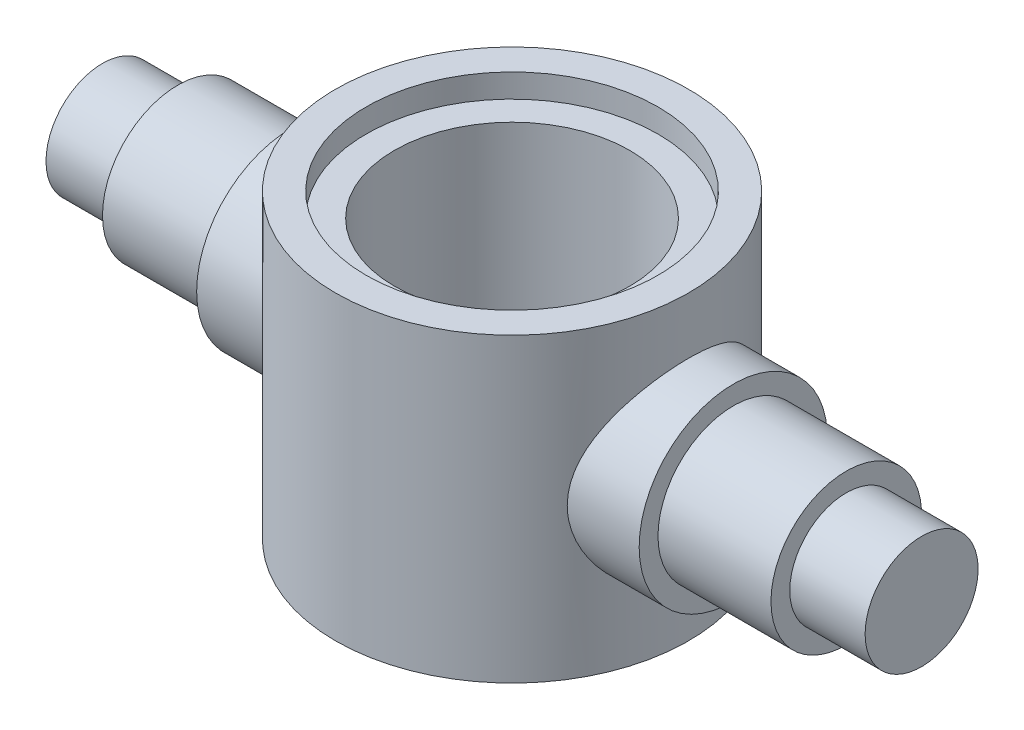
ISO-10303-21;
HEADER;
FILE_DESCRIPTION(('STEP AP214'),'2;1');
FILE_NAME('part.step','',(''),(''),'','','');
FILE_SCHEMA(('AUTOMOTIVE_DESIGN { 1 0 10303 214 1 1 1 1 }'));
ENDSEC;
DATA;
#1=APPLICATION_CONTEXT('core data for automotive mechanical design processes');
#2=APPLICATION_PROTOCOL_DEFINITION('international standard','automotive_design',2000,#1);
#3=PRODUCT_CONTEXT('',#1,'mechanical');
#4=PRODUCT('Part','Part','',(#3));
#5=PRODUCT_RELATED_PRODUCT_CATEGORY('part','',(#4));
#6=PRODUCT_DEFINITION_FORMATION('','',#4);
#7=PRODUCT_DEFINITION_CONTEXT('part definition',#1,'design');
#8=PRODUCT_DEFINITION('design','',#6,#7);
#9=PRODUCT_DEFINITION_SHAPE('','',#8);
#10=(LENGTH_UNIT() NAMED_UNIT(*) SI_UNIT(.MILLI.,.METRE.));
#11=(NAMED_UNIT(*) PLANE_ANGLE_UNIT() SI_UNIT($,.RADIAN.));
#12=(NAMED_UNIT(*) SI_UNIT($,.STERADIAN.) SOLID_ANGLE_UNIT());
#13=UNCERTAINTY_MEASURE_WITH_UNIT(LENGTH_MEASURE(1.E-05),#10,'distance_accuracy_value','');
#14=(GEOMETRIC_REPRESENTATION_CONTEXT(3) GLOBAL_UNCERTAINTY_ASSIGNED_CONTEXT((#13)) GLOBAL_UNIT_ASSIGNED_CONTEXT((#10,
#11,#12)) REPRESENTATION_CONTEXT('',''));
#15=CARTESIAN_POINT('',(0.,0.,0.));
#16=DIRECTION('',(0.,0.,1.));
#17=DIRECTION('',(1.,0.,0.));
#18=AXIS2_PLACEMENT_3D('',#15,#16,#17);
#19=CARTESIAN_POINT('',(-87.,0.,0.));
#20=DIRECTION('',(-1.,0.,0.));
#21=DIRECTION('',(0.,0.,1.));
#22=AXIS2_PLACEMENT_3D('',#19,#20,#21);
#23=CYLINDRICAL_SURFACE('',#22,20.);
#24=CARTESIAN_POINT('',(47.,0.,0.));
#25=DIRECTION('',(-1.,0.,0.));
#26=DIRECTION('',(0.,0.,1.));
#27=AXIS2_PLACEMENT_3D('',#24,#25,#26);
#28=CIRCLE('',#27,20.);
#29=CARTESIAN_POINT('',(47.,0.,20.));
#30=VERTEX_POINT('',#29);
#31=EDGE_CURVE('E122',#30,#30,#28,.T.);
#32=ORIENTED_EDGE('',*,*,#31,.T.);
#33=EDGE_LOOP('',(#32));
#34=FACE_BOUND('',#33,.T.);
#35=CARTESIAN_POINT('',(31.7214438511238,0.,20.));
#36=CARTESIAN_POINT('',(31.7214413197549,0.51570182078703,20.0000020694901));
#37=CARTESIAN_POINT('',(31.7340611544833,1.03138048086282,19.9800293716016));
#38=CARTESIAN_POINT('',(31.78403302211,2.05864988227541,19.900438433849));
#39=CARTESIAN_POINT('',(31.8213943564752,2.57023901293608,19.8408052837619));
#40=CARTESIAN_POINT('',(31.9194708010755,3.58588736208425,19.6826321785823));
#41=CARTESIAN_POINT('',(31.9802225019509,4.08993349078952,19.5840312579613));
#42=CARTESIAN_POINT('',(32.1228120348831,5.08606982289711,19.3492573673804));
#43=CARTESIAN_POINT('',(32.2046484379935,5.57816083404603,19.2130869435256));
#44=CARTESIAN_POINT('',(32.3860581030205,6.54451950031659,18.9056831081237));
#45=CARTESIAN_POINT('',(32.4855226248946,7.01887598033731,18.7346637469901));
#46=CARTESIAN_POINT('',(32.6994454251222,7.95042793399519,18.3587310871486));
#47=CARTESIAN_POINT('',(32.8139039052888,8.40762317654205,18.1538173322254));
#48=CARTESIAN_POINT('',(33.0546162705233,9.30288077314573,17.7117378683888));
#49=CARTESIAN_POINT('',(33.1808702230501,9.74094301775891,17.4745719750203));
#50=CARTESIAN_POINT('',(33.4419805558321,10.5963194801134,16.9695240952739));
#51=CARTESIAN_POINT('',(33.5768377375167,11.0136317584403,16.7016392454284));
#52=CARTESIAN_POINT('',(33.8650704272837,11.8645739174769,16.1097902433487));
#53=CARTESIAN_POINT('',(34.0189893385901,12.2959988155331,15.7829171398827));
#54=CARTESIAN_POINT('',(34.3293470223575,13.1302687696288,15.0959577863311));
#55=CARTESIAN_POINT('',(34.4857849024671,13.5331236847503,14.7358830932635));
#56=CARTESIAN_POINT('',(34.7975461774921,14.3089302194614,13.983797171619));
#57=CARTESIAN_POINT('',(34.9528686791821,14.6818598793333,13.5917629081743));
#58=CARTESIAN_POINT('',(35.2586221892624,15.3955976257313,12.7776616216099));
#59=CARTESIAN_POINT('',(35.4090530223891,15.7364045621611,12.3555935241317));
#60=CARTESIAN_POINT('',(35.7131343434369,16.4096071243127,11.4485193546584));
#61=CARTESIAN_POINT('',(35.8660898708008,16.7391795739264,10.9611773223788));
#62=CARTESIAN_POINT('',(36.15795916573,17.3557414498559,9.95619250224609));
#63=CARTESIAN_POINT('',(36.2968719878858,17.6427280097321,9.43854767799109));
#64=CARTESIAN_POINT('',(36.5565862255492,18.1710455089747,8.37643552854965));
#65=CARTESIAN_POINT('',(36.6773975574936,18.41240146501,7.8319831080315));
#66=CARTESIAN_POINT('',(36.8973465027634,18.8467311540172,6.71989087808538));
#67=CARTESIAN_POINT('',(36.9964867957197,19.0397108691608,6.15225394574328));
#68=CARTESIAN_POINT('',(37.1630977607828,19.3613843695543,5.04409084493633));
#69=CARTESIAN_POINT('',(37.2324534149286,19.4939561926983,4.50497266267377));
#70=CARTESIAN_POINT('',(37.3481817500676,19.7140932565086,3.41518253756318));
#71=CARTESIAN_POINT('',(37.3945555415014,19.8016606717114,2.86451115428459));
#72=CARTESIAN_POINT('',(37.4629444529341,19.9305089797469,1.75660288316388));
#73=CARTESIAN_POINT('',(37.4849739634215,19.9718172176824,1.19937007105453));
#74=CARTESIAN_POINT('',(37.5040622320361,20.0076218669366,0.0829912230449149));
#75=CARTESIAN_POINT('',(37.5011228064177,20.0021216831258,-0.476154670739204));
#76=CARTESIAN_POINT('',(37.4718952134176,19.9472644127489,-1.53619969533001));
#77=CARTESIAN_POINT('',(37.447941625247,19.9022922570022,-2.03739765283053));
#78=CARTESIAN_POINT('',(37.3804254421803,19.7749621587988,-3.03364583244081));
#79=CARTESIAN_POINT('',(37.336864425253,19.6926072248326,-3.52869654597526));
#80=CARTESIAN_POINT('',(37.2311612258913,19.4914513891179,-4.50931008296979));
#81=CARTESIAN_POINT('',(37.169018411795,19.3726492483943,-4.99487258329355));
#82=CARTESIAN_POINT('',(37.027573965224,19.0998645810979,-5.95344599270103));
#83=CARTESIAN_POINT('',(36.9482716812061,18.9458807186661,-6.42645642441813));
#84=CARTESIAN_POINT('',(36.7732171370194,18.6021940192179,-7.36274655171216));
#85=CARTESIAN_POINT('',(36.6772802358766,18.4120876761664,-7.82584330093237));
#86=CARTESIAN_POINT('',(36.4716939845828,17.9990703595971,-8.73397464778428));
#87=CARTESIAN_POINT('',(36.3620446819263,17.7761594997008,-9.17900930796888));
#88=CARTESIAN_POINT('',(36.131272901652,17.2992035665849,-10.0490666696836));
#89=CARTESIAN_POINT('',(36.010147984287,17.0451518693495,-10.4740850868216));
#90=CARTESIAN_POINT('',(35.7588507258766,16.5076300698118,-11.3022971689998));
#91=CARTESIAN_POINT('',(35.6286775729619,16.2241573265239,-11.7054888698094));
#92=CARTESIAN_POINT('',(35.3479837001356,15.5985893577811,-12.5291017597988));
#93=CARTESIAN_POINT('',(35.1967519612719,15.2534633423082,-12.9469820282129));
#94=CARTESIAN_POINT('',(34.8898864322466,14.5313798049263,-13.7525145719855));
#95=CARTESIAN_POINT('',(34.7342523759753,14.1544203560153,-14.1401650146786));
#96=CARTESIAN_POINT('',(34.4221027596449,13.3701405977241,-14.8839378037101));
#97=CARTESIAN_POINT('',(34.2655865379978,12.9627935496855,-15.2400317655331));
#98=CARTESIAN_POINT('',(34.0331936948478,12.3307195861961,-15.7488582454633));
#99=CARTESIAN_POINT('',(33.9561234387993,12.116510807287,-15.9142538119811));
#100=CARTESIAN_POINT('',(33.8032361130119,11.681195108966,-16.2364723560311));
#101=CARTESIAN_POINT('',(33.7274194456973,11.460086037774,-16.3932926166317));
#102=CARTESIAN_POINT('',(33.4907542486226,10.7512386458969,-16.8746465090342));
#103=CARTESIAN_POINT('',(33.3331303726971,10.2513083612089,-17.183049816068));
#104=CARTESIAN_POINT('',(33.031412186725,9.22309815410545,-17.7561472395889));
#105=CARTESIAN_POINT('',(32.8873166157949,8.69482088095187,-18.0208454312885));
#106=CARTESIAN_POINT('',(32.685373204814,7.88366626468449,-18.3830210735658));
#107=CARTESIAN_POINT('',(32.6204376652755,7.61021828324998,-18.497913664606));
#108=CARTESIAN_POINT('',(32.4959350905403,7.05750140500056,-18.715766604051));
#109=CARTESIAN_POINT('',(32.4363666973876,6.77823400271511,-18.8187299725957));
#110=CARTESIAN_POINT('',(32.2666643418834,5.93231320321243,-19.1092351768966));
#111=CARTESIAN_POINT('',(32.1654913144154,5.35737558916737,-19.2784662419718));
#112=CARTESIAN_POINT('',(31.9988861161109,4.23790937229368,-19.553644852043));
#113=CARTESIAN_POINT('',(31.9312218408957,3.69469269630251,-19.6636096891331));
#114=CARTESIAN_POINT('',(31.8230088610287,2.59831392694321,-19.8382645405692));
#115=CARTESIAN_POINT('',(31.7824584887167,2.04515244738684,-19.9029573394163));
#116=CARTESIAN_POINT('',(31.7303596382575,0.934456021777512,-19.985912455731));
#117=CARTESIAN_POINT('',(31.7187871405883,0.376925082364806,-20.0042132273243));
#118=CARTESIAN_POINT('',(31.7251253336693,-0.737521490785033,-19.9941613677195));
#119=CARTESIAN_POINT('',(31.7430332884698,-1.29443717682133,-19.9658130658148));
#120=CARTESIAN_POINT('',(31.8031799920284,-2.32861782358091,-19.8698354015943));
#121=CARTESIAN_POINT('',(31.8418706692055,-2.80663609459944,-19.807924313161));
#122=CARTESIAN_POINT('',(31.9394259539984,-3.75490327816778,-19.6502332853426));
#123=CARTESIAN_POINT('',(31.9982883825839,-4.22515302415461,-19.5544570041705));
#124=CARTESIAN_POINT('',(32.1343134663898,-5.15517852611526,-19.3301078005834));
#125=CARTESIAN_POINT('',(32.2114817676516,-5.61495100255831,-19.201524758723));
#126=CARTESIAN_POINT('',(32.3818032876244,-6.52146009102426,-18.9128757451853));
#127=CARTESIAN_POINT('',(32.4749575693242,-6.96819583385591,-18.7528076798059));
#128=CARTESIAN_POINT('',(32.6790924939383,-7.86590665438223,-18.394868382629));
#129=CARTESIAN_POINT('',(32.7906769723497,-8.31620402945306,-18.1956441409796));
#130=CARTESIAN_POINT('',(33.0255036652219,-9.19863635779434,-17.7658681503462));
#131=CARTESIAN_POINT('',(33.1487507806546,-9.63076356428131,-17.5353032131866));
#132=CARTESIAN_POINT('',(33.4038459659315,-10.4751592846687,-17.0443420482753));
#133=CARTESIAN_POINT('',(33.5356955921125,-10.8874241815632,-16.7839404160909));
#134=CARTESIAN_POINT('',(33.8049994573716,-11.6906450394737,-16.234702654998));
#135=CARTESIAN_POINT('',(33.9424541622186,-12.0815992232859,-15.9458641602208));
#136=CARTESIAN_POINT('',(34.2405301224172,-12.8968327162095,-15.2964635816017));
#137=CARTESIAN_POINT('',(34.4015818188523,-13.3175400727492,-14.931603315024));
#138=CARTESIAN_POINT('',(34.7230603870092,-14.1272437684801,-14.167947195493));
#139=CARTESIAN_POINT('',(34.8834872037932,-14.5162373768361,-13.7691484261636));
#140=CARTESIAN_POINT('',(35.1997632767684,-15.260632807053,-12.9392398085584));
#141=CARTESIAN_POINT('',(35.3556102206973,-15.6160178550132,-12.5081140164347));
#142=CARTESIAN_POINT('',(35.6587690792794,-16.2907536419708,-11.6156902573407));
#143=CARTESIAN_POINT('',(35.806080997209,-16.610104394801,-11.154392301953));
#144=CARTESIAN_POINT('',(36.094362584448,-17.2229254898073,-10.183991767619));
#145=CARTESIAN_POINT('',(36.2348110597733,-17.514759715978,-9.67369760070825));
#146=CARTESIAN_POINT('',(36.4984653992381,-18.0538993037871,-8.62576948259295));
#147=CARTESIAN_POINT('',(36.6216704607758,-18.3012025928681,-8.08813426037456));
#148=CARTESIAN_POINT('',(36.8470982051941,-18.7482234390732,-6.98966501489582));
#149=CARTESIAN_POINT('',(36.9493376652579,-18.9479790657331,-6.42884997594813));
#150=CARTESIAN_POINT('',(37.1297639484466,-19.297455902112,-5.28809092848528));
#151=CARTESIAN_POINT('',(37.2079541014261,-19.4471840388594,-4.70814958051197));
#152=CARTESIAN_POINT('',(37.3313253205698,-19.6821437839116,-3.59240502635106));
#153=CARTESIAN_POINT('',(37.3790061362655,-19.772289467478,-3.05790886541162));
#154=CARTESIAN_POINT('',(37.4514756910781,-19.9089530850035,-1.98183214986325));
#155=CARTESIAN_POINT('',(37.4762659729213,-19.9554739590957,-1.44025207517585));
#156=CARTESIAN_POINT('',(37.5022507552866,-20.0042303784103,-0.354749121186335));
#157=CARTESIAN_POINT('',(37.5034543739556,-20.0064830368679,0.189172771475637));
#158=CARTESIAN_POINT('',(37.48225381449,-19.9667133892609,1.27491994456976));
#159=CARTESIAN_POINT('',(37.4598506152682,-19.924692919087,1.81674531100428));
#160=CARTESIAN_POINT('',(37.3948348646929,-19.8021741343333,2.84994112337195));
#161=CARTESIAN_POINT('',(37.3540126106644,-19.7250802887853,3.34183352060927));
#162=CARTESIAN_POINT('',(37.2539453649987,-19.5349170787364,4.31666546450882));
#163=CARTESIAN_POINT('',(37.194701640845,-19.4218501893373,4.79960562470529));
#164=CARTESIAN_POINT('',(37.0591262897866,-19.1609304561323,5.75354734954825));
#165=CARTESIAN_POINT('',(36.9827935773181,-19.013075402407,6.2245481536402));
#166=CARTESIAN_POINT('',(36.8147019731365,-18.6840113486702,7.15191066342814));
#167=CARTESIAN_POINT('',(36.7229423463092,-18.5028007591816,7.60827167028259));
#168=CARTESIAN_POINT('',(36.5221995412676,-18.1011724085677,8.52087859171127));
#169=CARTESIAN_POINT('',(36.4126979975698,-17.8795354415977,8.97647337098126));
#170=CARTESIAN_POINT('',(36.181500114623,-17.4038544118732,9.86715686443599));
#171=CARTESIAN_POINT('',(36.0598036029384,-17.1498098908654,10.302245288535));
#172=CARTESIAN_POINT('',(35.806694576421,-16.6110188950497,11.1501774118709));
#173=CARTESIAN_POINT('',(35.6752791500568,-16.3262632081789,11.5630143806003));
#174=CARTESIAN_POINT('',(35.4054002469024,-15.7278002398746,12.3647313652331));
#175=CARTESIAN_POINT('',(35.2669360542545,-15.4140900152394,12.7536089389721));
#176=CARTESIAN_POINT('',(34.9701881968126,-14.7231741657298,13.5475000625257));
#177=CARTESIAN_POINT('',(34.8114036833638,-14.3427819832896,13.9495579337109));
#178=CARTESIAN_POINT('',(34.4924513936402,-13.5503054853644,14.7205601593971));
#179=CARTESIAN_POINT('',(34.332283513974,-13.1382187825437,15.0895020149462));
#180=CARTESIAN_POINT('',(34.014472849533,-12.2838013095431,15.7928698949614));
#181=CARTESIAN_POINT('',(33.8568330900945,-11.8414372203949,16.1272568440539));
#182=CARTESIAN_POINT('',(33.5485438943854,-10.928825106116,16.7591408544251));
#183=CARTESIAN_POINT('',(33.397894058606,-10.4585786781072,17.0566400256525));
#184=CARTESIAN_POINT('',(33.1001514260429,-9.4660459672117,17.6277979510643));
#185=CARTESIAN_POINT('',(32.9536922787388,-8.94232063328413,17.8992953962635));
#186=CARTESIAN_POINT('',(32.678737395606,-7.86886091086252,18.3964918948525));
#187=CARTESIAN_POINT('',(32.5502447158571,-7.31912211873665,18.6221831595938));
#188=CARTESIAN_POINT('',(32.3168186734203,-6.19886278931984,19.024384907481));
#189=CARTESIAN_POINT('',(32.2118191995507,-5.6284059565814,19.201033745358));
#190=CARTESIAN_POINT('',(32.0297506359913,-4.47007390274584,19.5032386917275));
#191=CARTESIAN_POINT('',(31.9526630686697,-3.88221048468109,19.6288286079236));
#192=CARTESIAN_POINT('',(31.8356174945192,-2.74707803789609,19.8180391560448));
#193=CARTESIAN_POINT('',(31.792971577938,-2.20083618219898,19.8861700850289));
#194=CARTESIAN_POINT('',(31.7358855783688,-1.1030541872115,19.9771502535946));
#195=CARTESIAN_POINT('',(31.7214465582793,-0.551513849049512,19.9999977867977));
#196=CARTESIAN_POINT('',(31.7214438511238,0.,20.));
#197=B_SPLINE_CURVE_WITH_KNOTS('',3,(#35,#36,#37,#38,#39,#40,#41,#42,#43,#44,#45,#46,#47,#48,
#49,#50,#51,#52,#53,#54,#55,#56,#57,#58,#59,#60,#61,#62,#63,#64,#65,#66,#67,#68,#69,#70,#71,#72,
#73,#74,#75,#76,#77,#78,#79,#80,#81,#82,#83,#84,#85,#86,#87,#88,#89,#90,#91,#92,#93,#94,#95,#96,
#97,#98,#99,#100,#101,#102,#103,#104,#105,#106,#107,#108,#109,#110,#111,#112,#113,#114,#115,
#116,#117,#118,#119,#120,#121,#122,#123,#124,#125,#126,#127,#128,#129,#130,#131,#132,#133,#134,
#135,#136,#137,#138,#139,#140,#141,#142,#143,#144,#145,#146,#147,#148,#149,#150,#151,#152,#153,
#154,#155,#156,#157,#158,#159,#160,#161,#162,#163,#164,#165,#166,#167,#168,#169,#170,#171,#172,
#173,#174,#175,#176,#177,#178,#179,#180,#181,#182,#183,#184,#185,#186,#187,#188,#189,#190,#191,
#192,#193,#194,#195,#196),.UNSPECIFIED.,.T.,.F.,(4,2,2,2,2,2,2,2,2,2,2,2,2,2,2,2,2,2,2,2,2,2,2,
2,2,2,2,2,2,2,2,2,2,2,2,2,2,2,2,2,2,2,2,2,2,2,2,2,2,2,2,2,2,2,2,2,2,2,2,2,2,2,2,2,2,2,2,2,2,2,2,
2,2,2,2,2,2,2,2,2,4),(0.,1.54653102412566,3.0936437906582,4.6431866763651,6.19262457451161,
7.73281777044317,9.27303169891885,10.8132544364963,12.3536208628203,14.040050545629,
15.7258954056102,17.4129662674639,19.1000975089252,20.9213689398888,22.7427629043674,
24.5631553877423,26.3833226515055,28.059489973695,29.7355762987163,31.4106713180379,
33.0856444910623,34.5951981761441,36.1046303969191,37.6141139345514,39.1236547971857,
40.6511712473975,42.1786824070403,43.706519051639,45.2344929615787,46.9207293716491,
48.6070679294707,50.2949082420574,51.1388926875629,51.9831430032304,53.8052600800145,
55.6272071603968,56.5377943533881,57.4481505054851,59.2683063920866,60.9409458022714,
62.6134823260862,64.2846320385256,65.9556266677268,67.4046488518206,68.853514556278,
70.3028277136488,71.7522372805584,73.2653941231695,74.7791896853173,76.2932598817077,
77.8074561511926,79.544658326591,81.2820099328677,83.0202241182139,84.7584376362927,
86.569187179535,88.3800209768546,90.1893999970791,91.9985283787263,93.6287396195841,
95.2588409829981,96.8883121683758,98.5177157865105,100.014703624748,101.511588485983,
103.008568462574,104.505619792595,106.059030766784,107.612463709144,109.166363919111,
110.720422255902,112.445990412954,114.171688673013,115.899317510118,117.626847482728,
119.447862072683,121.269186039717,123.085318370938,124.900246218139,126.554111116078,
128.208038334114),.UNSPECIFIED.);
#198=CARTESIAN_POINT('',(31.7214438511238,0.,20.));
#199=VERTEX_POINT('',#198);
#200=EDGE_CURVE('E10',#199,#199,#197,.T.);
#201=ORIENTED_EDGE('',*,*,#200,.F.);
#202=EDGE_LOOP('',(#201));
#203=FACE_BOUND('',#202,.T.);
#204=ADVANCED_FACE('F43',(#34,#203),#23,.T.);
#205=CARTESIAN_POINT('',(87.,0.,0.));
#206=DIRECTION('',(-1.,0.,0.));
#207=DIRECTION('',(0.,0.,1.));
#208=AXIS2_PLACEMENT_3D('',#205,#206,#207);
#209=PLANE('',#208);
#210=CARTESIAN_POINT('',(87.,0.,0.));
#211=DIRECTION('',(-1.,0.,0.));
#212=DIRECTION('',(0.,0.,1.));
#213=AXIS2_PLACEMENT_3D('',#210,#211,#212);
#214=CIRCLE('',#213,12.);
#215=CARTESIAN_POINT('',(87.,0.,12.));
#216=VERTEX_POINT('',#215);
#217=EDGE_CURVE('E61',#216,#216,#214,.T.);
#218=ORIENTED_EDGE('',*,*,#217,.F.);
#219=EDGE_LOOP('',(#218));
#220=FACE_BOUND('',#219,.T.);
#221=ADVANCED_FACE('F45',(#220),#209,.F.);
#222=CARTESIAN_POINT('',(-87.,0.,0.));
#223=DIRECTION('',(-1.,0.,0.));
#224=DIRECTION('',(0.,0.,1.));
#225=AXIS2_PLACEMENT_3D('',#222,#223,#224);
#226=CYLINDRICAL_SURFACE('',#225,12.);
#227=CARTESIAN_POINT('',(71.,0.,0.));
#228=DIRECTION('',(-1.,0.,0.));
#229=DIRECTION('',(0.,0.,1.));
#230=AXIS2_PLACEMENT_3D('',#227,#228,#229);
#231=CIRCLE('',#230,12.);
#232=CARTESIAN_POINT('',(71.,0.,12.));
#233=VERTEX_POINT('',#232);
#234=EDGE_CURVE('E66',#233,#233,#231,.T.);
#235=ORIENTED_EDGE('',*,*,#234,.F.);
#236=EDGE_LOOP('',(#235));
#237=FACE_BOUND('',#236,.T.);
#238=ORIENTED_EDGE('',*,*,#217,.T.);
#239=EDGE_LOOP('',(#238));
#240=FACE_BOUND('',#239,.T.);
#241=ADVANCED_FACE('F117',(#237,#240),#226,.T.);
#242=CARTESIAN_POINT('',(71.,0.,-12.));
#243=DIRECTION('',(-1.,0.,0.));
#244=DIRECTION('',(0.,0.,1.));
#245=AXIS2_PLACEMENT_3D('',#242,#243,#244);
#246=PLANE('',#245);
#247=CARTESIAN_POINT('',(71.,0.,0.));
#248=DIRECTION('',(-1.,0.,0.));
#249=DIRECTION('',(0.,0.,1.));
#250=AXIS2_PLACEMENT_3D('',#247,#248,#249);
#251=CIRCLE('',#250,16.);
#252=CARTESIAN_POINT('',(71.,0.,16.));
#253=VERTEX_POINT('',#252);
#254=EDGE_CURVE('E131',#253,#253,#251,.T.);
#255=ORIENTED_EDGE('',*,*,#254,.F.);
#256=EDGE_LOOP('',(#255));
#257=FACE_BOUND('',#256,.T.);
#258=ORIENTED_EDGE('',*,*,#234,.T.);
#259=EDGE_LOOP('',(#258));
#260=FACE_BOUND('',#259,.T.);
#261=ADVANCED_FACE('F144',(#257,#260),#246,.F.);
#262=CARTESIAN_POINT('',(-87.,0.,0.));
#263=DIRECTION('',(-1.,0.,0.));
#264=DIRECTION('',(0.,0.,1.));
#265=AXIS2_PLACEMENT_3D('',#262,#263,#264);
#266=CYLINDRICAL_SURFACE('',#265,16.);
#267=CARTESIAN_POINT('',(47.,0.,0.));
#268=DIRECTION('',(-1.,0.,0.));
#269=DIRECTION('',(0.,0.,1.));
#270=AXIS2_PLACEMENT_3D('',#267,#268,#269);
#271=CIRCLE('',#270,16.);
#272=CARTESIAN_POINT('',(47.,0.,16.));
#273=VERTEX_POINT('',#272);
#274=EDGE_CURVE('E125',#273,#273,#271,.T.);
#275=ORIENTED_EDGE('',*,*,#274,.F.);
#276=EDGE_LOOP('',(#275));
#277=FACE_BOUND('',#276,.T.);
#278=ORIENTED_EDGE('',*,*,#254,.T.);
#279=EDGE_LOOP('',(#278));
#280=FACE_BOUND('',#279,.T.);
#281=ADVANCED_FACE('F152',(#277,#280),#266,.T.);
#282=CARTESIAN_POINT('',(47.,0.,-16.));
#283=DIRECTION('',(-1.,0.,0.));
#284=DIRECTION('',(0.,0.,1.));
#285=AXIS2_PLACEMENT_3D('',#282,#283,#284);
#286=PLANE('',#285);
#287=ORIENTED_EDGE('',*,*,#31,.F.);
#288=EDGE_LOOP('',(#287));
#289=FACE_BOUND('',#288,.T.);
#290=ORIENTED_EDGE('',*,*,#274,.T.);
#291=EDGE_LOOP('',(#290));
#292=FACE_BOUND('',#291,.T.);
#293=ADVANCED_FACE('F81',(#289,#292),#286,.F.);
#294=CARTESIAN_POINT('',(0.,32.,0.));
#295=DIRECTION('',(0.,-1.,0.));
#296=DIRECTION('',(0.,0.,-1.));
#297=AXIS2_PLACEMENT_3D('',#294,#295,#296);
#298=CYLINDRICAL_SURFACE('',#297,37.5);
#299=CARTESIAN_POINT('',(-31.7214438511238,0.,20.));
#300=CARTESIAN_POINT('',(-31.7214413197549,-0.51570182078703,20.0000020694901));
#301=CARTESIAN_POINT('',(-31.7340611544833,-1.03138048086282,19.9800293716016));
#302=CARTESIAN_POINT('',(-31.78403302211,-2.05864988227541,19.900438433849));
#303=CARTESIAN_POINT('',(-31.8213943564752,-2.57023901293608,19.8408052837619));
#304=CARTESIAN_POINT('',(-31.9194708010755,-3.58588736208425,19.6826321785823));
#305=CARTESIAN_POINT('',(-31.9802225019509,-4.08993349078952,19.5840312579613));
#306=CARTESIAN_POINT('',(-32.1228120348831,-5.08606982289711,19.3492573673804));
#307=CARTESIAN_POINT('',(-32.2046484379935,-5.57816083404603,19.2130869435256));
#308=CARTESIAN_POINT('',(-32.3860581030205,-6.54451950031659,18.9056831081237));
#309=CARTESIAN_POINT('',(-32.4855226248946,-7.01887598033731,18.7346637469901));
#310=CARTESIAN_POINT('',(-32.6994454251222,-7.95042793399519,18.3587310871486));
#311=CARTESIAN_POINT('',(-32.8139039052888,-8.40762317654205,18.1538173322254));
#312=CARTESIAN_POINT('',(-33.0546162705233,-9.30288077314573,17.7117378683888));
#313=CARTESIAN_POINT('',(-33.1808702230501,-9.74094301775891,17.4745719750203));
#314=CARTESIAN_POINT('',(-33.4419805558321,-10.5963194801134,16.9695240952739));
#315=CARTESIAN_POINT('',(-33.5768377375167,-11.0136317584403,16.7016392454284));
#316=CARTESIAN_POINT('',(-33.8650704272837,-11.8645739174769,16.1097902433487));
#317=CARTESIAN_POINT('',(-34.0189893385901,-12.2959988155331,15.7829171398827));
#318=CARTESIAN_POINT('',(-34.3293470223575,-13.1302687696288,15.0959577863311));
#319=CARTESIAN_POINT('',(-34.4857849024671,-13.5331236847503,14.7358830932635));
#320=CARTESIAN_POINT('',(-34.7975461774921,-14.3089302194614,13.983797171619));
#321=CARTESIAN_POINT('',(-34.9528686791821,-14.6818598793333,13.5917629081743));
#322=CARTESIAN_POINT('',(-35.2586221892624,-15.3955976257313,12.7776616216099));
#323=CARTESIAN_POINT('',(-35.4090530223891,-15.7364045621611,12.3555935241317));
#324=CARTESIAN_POINT('',(-35.7131343434369,-16.4096071243127,11.4485193546584));
#325=CARTESIAN_POINT('',(-35.8660898708008,-16.7391795739264,10.9611773223788));
#326=CARTESIAN_POINT('',(-36.15795916573,-17.3557414498559,9.95619250224609));
#327=CARTESIAN_POINT('',(-36.2968719878858,-17.6427280097321,9.43854767799109));
#328=CARTESIAN_POINT('',(-36.5565862255492,-18.1710455089747,8.37643552854965));
#329=CARTESIAN_POINT('',(-36.6773975574936,-18.41240146501,7.8319831080315));
#330=CARTESIAN_POINT('',(-36.8973465027634,-18.8467311540172,6.71989087808538));
#331=CARTESIAN_POINT('',(-36.9964867957197,-19.0397108691608,6.15225394574328));
#332=CARTESIAN_POINT('',(-37.1630977607828,-19.3613843695543,5.04409084493633));
#333=CARTESIAN_POINT('',(-37.2324534149286,-19.4939561926983,4.50497266267377));
#334=CARTESIAN_POINT('',(-37.3481817500676,-19.7140932565086,3.41518253756318));
#335=CARTESIAN_POINT('',(-37.3945555415014,-19.8016606717114,2.86451115428459));
#336=CARTESIAN_POINT('',(-37.4629444529341,-19.9305089797469,1.75660288316388));
#337=CARTESIAN_POINT('',(-37.4849739634215,-19.9718172176824,1.19937007105453));
#338=CARTESIAN_POINT('',(-37.5040622320361,-20.0076218669366,0.0829912230449149));
#339=CARTESIAN_POINT('',(-37.5011228064177,-20.0021216831258,-0.476154670739204));
#340=CARTESIAN_POINT('',(-37.4718952134176,-19.9472644127489,-1.53619969533001));
#341=CARTESIAN_POINT('',(-37.447941625247,-19.9022922570022,-2.03739765283053));
#342=CARTESIAN_POINT('',(-37.3804254421803,-19.7749621587988,-3.03364583244081));
#343=CARTESIAN_POINT('',(-37.336864425253,-19.6926072248326,-3.52869654597526));
#344=CARTESIAN_POINT('',(-37.2311612258913,-19.4914513891179,-4.50931008296979));
#345=CARTESIAN_POINT('',(-37.169018411795,-19.3726492483943,-4.99487258329355));
#346=CARTESIAN_POINT('',(-37.027573965224,-19.0998645810979,-5.95344599270103));
#347=CARTESIAN_POINT('',(-36.9482716812061,-18.9458807186661,-6.42645642441813));
#348=CARTESIAN_POINT('',(-36.7732171370194,-18.6021940192179,-7.36274655171216));
#349=CARTESIAN_POINT('',(-36.6772802358766,-18.4120876761664,-7.82584330093237));
#350=CARTESIAN_POINT('',(-36.4716939845828,-17.9990703595971,-8.73397464778428));
#351=CARTESIAN_POINT('',(-36.3620446819263,-17.7761594997008,-9.17900930796888));
#352=CARTESIAN_POINT('',(-36.131272901652,-17.2992035665849,-10.0490666696836));
#353=CARTESIAN_POINT('',(-36.010147984287,-17.0451518693495,-10.4740850868216));
#354=CARTESIAN_POINT('',(-35.7588507258766,-16.5076300698118,-11.3022971689998));
#355=CARTESIAN_POINT('',(-35.6286775729619,-16.2241573265239,-11.7054888698094));
#356=CARTESIAN_POINT('',(-35.3479837001356,-15.5985893577811,-12.5291017597988));
#357=CARTESIAN_POINT('',(-35.1967519612719,-15.2534633423082,-12.9469820282129));
#358=CARTESIAN_POINT('',(-34.8898864322466,-14.5313798049263,-13.7525145719855));
#359=CARTESIAN_POINT('',(-34.7342523759753,-14.1544203560153,-14.1401650146786));
#360=CARTESIAN_POINT('',(-34.4221027596449,-13.3701405977241,-14.8839378037101));
#361=CARTESIAN_POINT('',(-34.2655865379978,-12.9627935496855,-15.2400317655331));
#362=CARTESIAN_POINT('',(-34.0331936948478,-12.3307195861961,-15.7488582454633));
#363=CARTESIAN_POINT('',(-33.9561234387993,-12.116510807287,-15.9142538119811));
#364=CARTESIAN_POINT('',(-33.8032361130119,-11.681195108966,-16.2364723560311));
#365=CARTESIAN_POINT('',(-33.7274194456973,-11.460086037774,-16.3932926166317));
#366=CARTESIAN_POINT('',(-33.4907542486226,-10.7512386458969,-16.8746465090342));
#367=CARTESIAN_POINT('',(-33.3331303726971,-10.2513083612089,-17.183049816068));
#368=CARTESIAN_POINT('',(-33.031412186725,-9.22309815410545,-17.7561472395889));
#369=CARTESIAN_POINT('',(-32.8873166157949,-8.69482088095187,-18.0208454312885));
#370=CARTESIAN_POINT('',(-32.685373204814,-7.88366626468449,-18.3830210735658));
#371=CARTESIAN_POINT('',(-32.6204376652755,-7.61021828324998,-18.497913664606));
#372=CARTESIAN_POINT('',(-32.4959350905403,-7.05750140500056,-18.715766604051));
#373=CARTESIAN_POINT('',(-32.4363666973876,-6.77823400271511,-18.8187299725957));
#374=CARTESIAN_POINT('',(-32.2666643418834,-5.93231320321243,-19.1092351768966));
#375=CARTESIAN_POINT('',(-32.1654913144154,-5.35737558916737,-19.2784662419718));
#376=CARTESIAN_POINT('',(-31.9988861161109,-4.23790937229368,-19.553644852043));
#377=CARTESIAN_POINT('',(-31.9312218408957,-3.69469269630251,-19.6636096891331));
#378=CARTESIAN_POINT('',(-31.8230088610287,-2.59831392694321,-19.8382645405692));
#379=CARTESIAN_POINT('',(-31.7824584887167,-2.04515244738684,-19.9029573394163));
#380=CARTESIAN_POINT('',(-31.7303596382575,-0.934456021777512,-19.985912455731));
#381=CARTESIAN_POINT('',(-31.7187871405883,-0.376925082364806,-20.0042132273243));
#382=CARTESIAN_POINT('',(-31.7251253336693,0.737521490785033,-19.9941613677195));
#383=CARTESIAN_POINT('',(-31.7430332884698,1.29443717682133,-19.9658130658148));
#384=CARTESIAN_POINT('',(-31.8031799920284,2.32861782358091,-19.8698354015943));
#385=CARTESIAN_POINT('',(-31.8418706692055,2.80663609459944,-19.807924313161));
#386=CARTESIAN_POINT('',(-31.9394259539984,3.75490327816778,-19.6502332853426));
#387=CARTESIAN_POINT('',(-31.9982883825839,4.22515302415461,-19.5544570041705));
#388=CARTESIAN_POINT('',(-32.1343134663898,5.15517852611526,-19.3301078005834));
#389=CARTESIAN_POINT('',(-32.2114817676516,5.61495100255831,-19.201524758723));
#390=CARTESIAN_POINT('',(-32.3818032876244,6.52146009102426,-18.9128757451853));
#391=CARTESIAN_POINT('',(-32.4749575693242,6.96819583385591,-18.7528076798059));
#392=CARTESIAN_POINT('',(-32.6790924939383,7.86590665438223,-18.394868382629));
#393=CARTESIAN_POINT('',(-32.7906769723497,8.31620402945306,-18.1956441409796));
#394=CARTESIAN_POINT('',(-33.0255036652219,9.19863635779434,-17.7658681503462));
#395=CARTESIAN_POINT('',(-33.1487507806546,9.63076356428131,-17.5353032131866));
#396=CARTESIAN_POINT('',(-33.4038459659315,10.4751592846687,-17.0443420482753));
#397=CARTESIAN_POINT('',(-33.5356955921125,10.8874241815632,-16.7839404160909));
#398=CARTESIAN_POINT('',(-33.8049994573716,11.6906450394737,-16.234702654998));
#399=CARTESIAN_POINT('',(-33.9424541622186,12.0815992232859,-15.9458641602208));
#400=CARTESIAN_POINT('',(-34.2405301224172,12.8968327162095,-15.2964635816017));
#401=CARTESIAN_POINT('',(-34.4015818188523,13.3175400727492,-14.931603315024));
#402=CARTESIAN_POINT('',(-34.7230603870092,14.1272437684801,-14.167947195493));
#403=CARTESIAN_POINT('',(-34.8834872037932,14.5162373768361,-13.7691484261636));
#404=CARTESIAN_POINT('',(-35.1997632767684,15.260632807053,-12.9392398085584));
#405=CARTESIAN_POINT('',(-35.3556102206973,15.6160178550132,-12.5081140164347));
#406=CARTESIAN_POINT('',(-35.6587690792794,16.2907536419708,-11.6156902573407));
#407=CARTESIAN_POINT('',(-35.806080997209,16.610104394801,-11.154392301953));
#408=CARTESIAN_POINT('',(-36.094362584448,17.2229254898073,-10.183991767619));
#409=CARTESIAN_POINT('',(-36.2348110597733,17.514759715978,-9.67369760070825));
#410=CARTESIAN_POINT('',(-36.4984653992381,18.0538993037871,-8.62576948259295));
#411=CARTESIAN_POINT('',(-36.6216704607758,18.3012025928681,-8.08813426037456));
#412=CARTESIAN_POINT('',(-36.8470982051941,18.7482234390732,-6.98966501489582));
#413=CARTESIAN_POINT('',(-36.9493376652579,18.9479790657331,-6.42884997594813));
#414=CARTESIAN_POINT('',(-37.1297639484466,19.297455902112,-5.28809092848528));
#415=CARTESIAN_POINT('',(-37.2079541014261,19.4471840388594,-4.70814958051197));
#416=CARTESIAN_POINT('',(-37.3313253205698,19.6821437839116,-3.59240502635106));
#417=CARTESIAN_POINT('',(-37.3790061362655,19.772289467478,-3.05790886541162));
#418=CARTESIAN_POINT('',(-37.4514756910781,19.9089530850035,-1.98183214986325));
#419=CARTESIAN_POINT('',(-37.4762659729213,19.9554739590957,-1.44025207517585));
#420=CARTESIAN_POINT('',(-37.5022507552866,20.0042303784103,-0.354749121186335));
#421=CARTESIAN_POINT('',(-37.5034543739556,20.0064830368679,0.189172771475637));
#422=CARTESIAN_POINT('',(-37.48225381449,19.9667133892609,1.27491994456976));
#423=CARTESIAN_POINT('',(-37.4598506152682,19.924692919087,1.81674531100428));
#424=CARTESIAN_POINT('',(-37.3948348646929,19.8021741343333,2.84994112337195));
#425=CARTESIAN_POINT('',(-37.3540126106644,19.7250802887853,3.34183352060927));
#426=CARTESIAN_POINT('',(-37.2539453649987,19.5349170787364,4.31666546450882));
#427=CARTESIAN_POINT('',(-37.194701640845,19.4218501893373,4.79960562470529));
#428=CARTESIAN_POINT('',(-37.0591262897866,19.1609304561323,5.75354734954825));
#429=CARTESIAN_POINT('',(-36.9827935773181,19.013075402407,6.2245481536402));
#430=CARTESIAN_POINT('',(-36.8147019731365,18.6840113486702,7.15191066342814));
#431=CARTESIAN_POINT('',(-36.7229423463092,18.5028007591816,7.60827167028259));
#432=CARTESIAN_POINT('',(-36.5221995412676,18.1011724085677,8.52087859171127));
#433=CARTESIAN_POINT('',(-36.4126979975698,17.8795354415977,8.97647337098126));
#434=CARTESIAN_POINT('',(-36.181500114623,17.4038544118732,9.86715686443599));
#435=CARTESIAN_POINT('',(-36.0598036029384,17.1498098908654,10.302245288535));
#436=CARTESIAN_POINT('',(-35.806694576421,16.6110188950497,11.1501774118709));
#437=CARTESIAN_POINT('',(-35.6752791500568,16.3262632081789,11.5630143806003));
#438=CARTESIAN_POINT('',(-35.4054002469024,15.7278002398746,12.3647313652331));
#439=CARTESIAN_POINT('',(-35.2669360542545,15.4140900152394,12.7536089389721));
#440=CARTESIAN_POINT('',(-34.9701881968126,14.7231741657298,13.5475000625257));
#441=CARTESIAN_POINT('',(-34.8114036833638,14.3427819832896,13.9495579337109));
#442=CARTESIAN_POINT('',(-34.4924513936402,13.5503054853644,14.7205601593971));
#443=CARTESIAN_POINT('',(-34.332283513974,13.1382187825437,15.0895020149462));
#444=CARTESIAN_POINT('',(-34.014472849533,12.2838013095431,15.7928698949614));
#445=CARTESIAN_POINT('',(-33.8568330900945,11.8414372203949,16.1272568440539));
#446=CARTESIAN_POINT('',(-33.5485438943854,10.928825106116,16.7591408544251));
#447=CARTESIAN_POINT('',(-33.397894058606,10.4585786781072,17.0566400256525));
#448=CARTESIAN_POINT('',(-33.1001514260429,9.4660459672117,17.6277979510643));
#449=CARTESIAN_POINT('',(-32.9536922787388,8.94232063328413,17.8992953962635));
#450=CARTESIAN_POINT('',(-32.678737395606,7.86886091086252,18.3964918948525));
#451=CARTESIAN_POINT('',(-32.5502447158571,7.31912211873665,18.6221831595938));
#452=CARTESIAN_POINT('',(-32.3168186734203,6.19886278931984,19.024384907481));
#453=CARTESIAN_POINT('',(-32.2118191995507,5.6284059565814,19.201033745358));
#454=CARTESIAN_POINT('',(-32.0297506359913,4.47007390274584,19.5032386917275));
#455=CARTESIAN_POINT('',(-31.9526630686697,3.88221048468109,19.6288286079236));
#456=CARTESIAN_POINT('',(-31.8356174945192,2.74707803789609,19.8180391560448));
#457=CARTESIAN_POINT('',(-31.792971577938,2.20083618219898,19.8861700850289));
#458=CARTESIAN_POINT('',(-31.7358855783688,1.1030541872115,19.9771502535946));
#459=CARTESIAN_POINT('',(-31.7214465582793,0.551513849049512,19.9999977867977));
#460=CARTESIAN_POINT('',(-31.7214438511238,0.,20.));
#461=B_SPLINE_CURVE_WITH_KNOTS('',3,(#299,#300,#301,#302,#303,#304,#305,#306,#307,#308,#309,
#310,#311,#312,#313,#314,#315,#316,#317,#318,#319,#320,#321,#322,#323,#324,#325,#326,#327,#328,
#329,#330,#331,#332,#333,#334,#335,#336,#337,#338,#339,#340,#341,#342,#343,#344,#345,#346,#347,
#348,#349,#350,#351,#352,#353,#354,#355,#356,#357,#358,#359,#360,#361,#362,#363,#364,#365,#366,
#367,#368,#369,#370,#371,#372,#373,#374,#375,#376,#377,#378,#379,#380,#381,#382,#383,#384,#385,
#386,#387,#388,#389,#390,#391,#392,#393,#394,#395,#396,#397,#398,#399,#400,#401,#402,#403,#404,
#405,#406,#407,#408,#409,#410,#411,#412,#413,#414,#415,#416,#417,#418,#419,#420,#421,#422,#423,
#424,#425,#426,#427,#428,#429,#430,#431,#432,#433,#434,#435,#436,#437,#438,#439,#440,#441,#442,
#443,#444,#445,#446,#447,#448,#449,#450,#451,#452,#453,#454,#455,#456,#457,#458,#459,#460),
.UNSPECIFIED.,.T.,.F.,(4,2,2,2,2,2,2,2,2,2,2,2,2,2,2,2,2,2,2,2,2,2,2,2,2,2,2,2,2,2,2,2,2,2,2,2,
2,2,2,2,2,2,2,2,2,2,2,2,2,2,2,2,2,2,2,2,2,2,2,2,2,2,2,2,2,2,2,2,2,2,2,2,2,2,2,2,2,2,2,2,4),(0.,
1.54653102412566,3.0936437906582,4.6431866763651,6.19262457451161,7.73281777044317,
9.27303169891885,10.8132544364963,12.3536208628203,14.040050545629,15.7258954056102,
17.4129662674639,19.1000975089252,20.9213689398888,22.7427629043674,24.5631553877423,
26.3833226515055,28.059489973695,29.7355762987163,31.4106713180379,33.0856444910623,
34.5951981761441,36.1046303969191,37.6141139345514,39.1236547971857,40.6511712473975,
42.1786824070403,43.706519051639,45.2344929615787,46.9207293716491,48.6070679294707,
50.2949082420574,51.1388926875629,51.9831430032304,53.8052600800145,55.6272071603968,
56.5377943533881,57.4481505054851,59.2683063920866,60.9409458022714,62.6134823260862,
64.2846320385256,65.9556266677268,67.4046488518206,68.853514556278,70.3028277136488,
71.7522372805584,73.2653941231695,74.7791896853173,76.2932598817077,77.8074561511926,
79.544658326591,81.2820099328677,83.0202241182139,84.7584376362927,86.569187179535,
88.3800209768546,90.1893999970791,91.9985283787263,93.6287396195841,95.2588409829981,
96.8883121683758,98.5177157865105,100.014703624748,101.511588485983,103.008568462574,
104.505619792595,106.059030766784,107.612463709144,109.166363919111,110.720422255902,
112.445990412954,114.171688673013,115.899317510118,117.626847482728,119.447862072683,
121.269186039717,123.085318370938,124.900246218139,126.554111116078,128.208038334114),.UNSPECIFIED.);
#462=CARTESIAN_POINT('',(-31.7214438511238,0.,20.));
#463=VERTEX_POINT('',#462);
#464=EDGE_CURVE('E56',#463,#463,#461,.T.);
#465=ORIENTED_EDGE('',*,*,#464,.T.);
#466=EDGE_LOOP('',(#465));
#467=FACE_BOUND('',#466,.T.);
#468=CARTESIAN_POINT('',(0.,32.,0.));
#469=DIRECTION('',(0.,1.,0.));
#470=DIRECTION('',(0.,0.,1.));
#471=AXIS2_PLACEMENT_3D('',#468,#469,#470);
#472=CIRCLE('',#471,37.5);
#473=CARTESIAN_POINT('',(0.,32.,37.5));
#474=VERTEX_POINT('',#473);
#475=EDGE_CURVE('E295',#474,#474,#472,.T.);
#476=ORIENTED_EDGE('',*,*,#475,.F.);
#477=EDGE_LOOP('',(#476));
#478=FACE_BOUND('',#477,.T.);
#479=CARTESIAN_POINT('',(0.,-32.,0.));
#480=DIRECTION('',(0.,1.,0.));
#481=DIRECTION('',(0.,0.,1.));
#482=AXIS2_PLACEMENT_3D('',#479,#480,#481);
#483=CIRCLE('',#482,37.5);
#484=CARTESIAN_POINT('',(0.,-32.,37.5));
#485=VERTEX_POINT('',#484);
#486=EDGE_CURVE('E294',#485,#485,#483,.T.);
#487=ORIENTED_EDGE('',*,*,#486,.T.);
#488=EDGE_LOOP('',(#487));
#489=FACE_BOUND('',#488,.T.);
#490=ORIENTED_EDGE('',*,*,#200,.T.);
#491=EDGE_LOOP('',(#490));
#492=FACE_BOUND('',#491,.T.);
#493=ADVANCED_FACE('F75',(#467,#478,#489,#492),#298,.T.);
#494=CARTESIAN_POINT('',(0.,32.,0.));
#495=DIRECTION('',(0.,1.,0.));
#496=DIRECTION('',(0.,0.,1.));
#497=AXIS2_PLACEMENT_3D('',#494,#495,#496);
#498=PLANE('',#497);
#499=CARTESIAN_POINT('',(0.,32.,0.));
#500=DIRECTION('',(0.,1.,0.));
#501=DIRECTION('',(0.,0.,1.));
#502=AXIS2_PLACEMENT_3D('',#499,#500,#501);
#503=CIRCLE('',#502,31.);
#504=CARTESIAN_POINT('',(0.,32.,31.));
#505=VERTEX_POINT('',#504);
#506=EDGE_CURVE('E280',#505,#505,#503,.T.);
#507=ORIENTED_EDGE('',*,*,#506,.F.);
#508=EDGE_LOOP('',(#507));
#509=FACE_BOUND('',#508,.T.);
#510=ORIENTED_EDGE('',*,*,#475,.T.);
#511=EDGE_LOOP('',(#510));
#512=FACE_BOUND('',#511,.T.);
#513=ADVANCED_FACE('F80',(#509,#512),#498,.T.);
#514=CARTESIAN_POINT('',(0.,-32.,0.));
#515=DIRECTION('',(0.,1.,0.));
#516=DIRECTION('',(0.,0.,1.));
#517=AXIS2_PLACEMENT_3D('',#514,#515,#516);
#518=PLANE('',#517);
#519=CARTESIAN_POINT('',(0.,-32.,0.));
#520=DIRECTION('',(0.,1.,0.));
#521=DIRECTION('',(0.,0.,1.));
#522=AXIS2_PLACEMENT_3D('',#519,#520,#521);
#523=CIRCLE('',#522,25.);
#524=CARTESIAN_POINT('',(0.,-32.,25.));
#525=VERTEX_POINT('',#524);
#526=EDGE_CURVE('E290',#525,#525,#523,.T.);
#527=ORIENTED_EDGE('',*,*,#526,.T.);
#528=EDGE_LOOP('',(#527));
#529=FACE_BOUND('',#528,.T.);
#530=ORIENTED_EDGE('',*,*,#486,.F.);
#531=EDGE_LOOP('',(#530));
#532=FACE_BOUND('',#531,.T.);
#533=ADVANCED_FACE('F82',(#529,#532),#518,.F.);
#534=CARTESIAN_POINT('',(-87.,0.,0.));
#535=DIRECTION('',(1.,0.,0.));
#536=DIRECTION('',(0.,0.,-1.));
#537=AXIS2_PLACEMENT_3D('',#534,#535,#536);
#538=PLANE('',#537);
#539=CARTESIAN_POINT('',(-87.,0.,0.));
#540=DIRECTION('',(-1.,0.,0.));
#541=DIRECTION('',(0.,0.,1.));
#542=AXIS2_PLACEMENT_3D('',#539,#540,#541);
#543=CIRCLE('',#542,12.);
#544=CARTESIAN_POINT('',(-87.,0.,12.));
#545=VERTEX_POINT('',#544);
#546=EDGE_CURVE('E299',#545,#545,#543,.T.);
#547=ORIENTED_EDGE('',*,*,#546,.T.);
#548=EDGE_LOOP('',(#547));
#549=FACE_BOUND('',#548,.T.);
#550=ADVANCED_FACE('F84',(#549),#538,.F.);
#551=CARTESIAN_POINT('',(-87.,0.,0.));
#552=DIRECTION('',(-1.,0.,0.));
#553=DIRECTION('',(0.,0.,1.));
#554=AXIS2_PLACEMENT_3D('',#551,#552,#553);
#555=CYLINDRICAL_SURFACE('',#554,12.);
#556=ORIENTED_EDGE('',*,*,#546,.F.);
#557=EDGE_LOOP('',(#556));
#558=FACE_BOUND('',#557,.T.);
#559=CARTESIAN_POINT('',(-71.,0.,0.));
#560=DIRECTION('',(-1.,0.,0.));
#561=DIRECTION('',(0.,0.,1.));
#562=AXIS2_PLACEMENT_3D('',#559,#560,#561);
#563=CIRCLE('',#562,12.);
#564=CARTESIAN_POINT('',(-71.,0.,12.));
#565=VERTEX_POINT('',#564);
#566=EDGE_CURVE('E306',#565,#565,#563,.T.);
#567=ORIENTED_EDGE('',*,*,#566,.T.);
#568=EDGE_LOOP('',(#567));
#569=FACE_BOUND('',#568,.T.);
#570=ADVANCED_FACE('F88',(#558,#569),#555,.T.);
#571=CARTESIAN_POINT('',(-71.,0.,-12.));
#572=DIRECTION('',(1.,0.,0.));
#573=DIRECTION('',(0.,0.,-1.));
#574=AXIS2_PLACEMENT_3D('',#571,#572,#573);
#575=PLANE('',#574);
#576=ORIENTED_EDGE('',*,*,#566,.F.);
#577=EDGE_LOOP('',(#576));
#578=FACE_BOUND('',#577,.T.);
#579=CARTESIAN_POINT('',(-71.,0.,0.));
#580=DIRECTION('',(-1.,0.,0.));
#581=DIRECTION('',(0.,0.,1.));
#582=AXIS2_PLACEMENT_3D('',#579,#580,#581);
#583=CIRCLE('',#582,16.);
#584=CARTESIAN_POINT('',(-71.,0.,16.));
#585=VERTEX_POINT('',#584);
#586=EDGE_CURVE('E310',#585,#585,#583,.T.);
#587=ORIENTED_EDGE('',*,*,#586,.T.);
#588=EDGE_LOOP('',(#587));
#589=FACE_BOUND('',#588,.T.);
#590=ADVANCED_FACE('F92',(#578,#589),#575,.F.);
#591=CARTESIAN_POINT('',(-87.,0.,0.));
#592=DIRECTION('',(-1.,0.,0.));
#593=DIRECTION('',(0.,0.,1.));
#594=AXIS2_PLACEMENT_3D('',#591,#592,#593);
#595=CYLINDRICAL_SURFACE('',#594,16.);
#596=ORIENTED_EDGE('',*,*,#586,.F.);
#597=EDGE_LOOP('',(#596));
#598=FACE_BOUND('',#597,.T.);
#599=CARTESIAN_POINT('',(-47.,0.,0.));
#600=DIRECTION('',(-1.,0.,0.));
#601=DIRECTION('',(0.,0.,1.));
#602=AXIS2_PLACEMENT_3D('',#599,#600,#601);
#603=CIRCLE('',#602,16.);
#604=CARTESIAN_POINT('',(-47.,0.,16.));
#605=VERTEX_POINT('',#604);
#606=EDGE_CURVE('E134',#605,#605,#603,.T.);
#607=ORIENTED_EDGE('',*,*,#606,.T.);
#608=EDGE_LOOP('',(#607));
#609=FACE_BOUND('',#608,.T.);
#610=ADVANCED_FACE('F96',(#598,#609),#595,.T.);
#611=CARTESIAN_POINT('',(-47.,0.,-16.));
#612=DIRECTION('',(1.,0.,0.));
#613=DIRECTION('',(0.,0.,-1.));
#614=AXIS2_PLACEMENT_3D('',#611,#612,#613);
#615=PLANE('',#614);
#616=ORIENTED_EDGE('',*,*,#606,.F.);
#617=EDGE_LOOP('',(#616));
#618=FACE_BOUND('',#617,.T.);
#619=CARTESIAN_POINT('',(-47.,0.,0.));
#620=DIRECTION('',(-1.,0.,0.));
#621=DIRECTION('',(0.,0.,1.));
#622=AXIS2_PLACEMENT_3D('',#619,#620,#621);
#623=CIRCLE('',#622,20.);
#624=CARTESIAN_POINT('',(-47.,0.,20.));
#625=VERTEX_POINT('',#624);
#626=EDGE_CURVE('E126',#625,#625,#623,.T.);
#627=ORIENTED_EDGE('',*,*,#626,.T.);
#628=EDGE_LOOP('',(#627));
#629=FACE_BOUND('',#628,.T.);
#630=ADVANCED_FACE('F99',(#618,#629),#615,.F.);
#631=ORIENTED_EDGE('',*,*,#626,.F.);
#632=EDGE_LOOP('',(#631));
#633=FACE_BOUND('',#632,.T.);
#634=ORIENTED_EDGE('',*,*,#464,.F.);
#635=EDGE_LOOP('',(#634));
#636=FACE_BOUND('',#635,.T.);
#637=ADVANCED_FACE('F102',(#633,#636),#23,.T.);
#638=CARTESIAN_POINT('',(0.,32.,0.));
#639=DIRECTION('',(0.,1.,0.));
#640=DIRECTION('',(0.,0.,1.));
#641=AXIS2_PLACEMENT_3D('',#638,#639,#640);
#642=CYLINDRICAL_SURFACE('',#641,25.);
#643=ORIENTED_EDGE('',*,*,#526,.F.);
#644=EDGE_LOOP('',(#643));
#645=FACE_BOUND('',#644,.T.);
#646=CARTESIAN_POINT('',(0.,27.,0.));
#647=DIRECTION('',(0.,1.,0.));
#648=DIRECTION('',(0.,0.,1.));
#649=AXIS2_PLACEMENT_3D('',#646,#647,#648);
#650=CIRCLE('',#649,25.);
#651=CARTESIAN_POINT('',(0.,27.,25.));
#652=VERTEX_POINT('',#651);
#653=EDGE_CURVE('E284',#652,#652,#650,.T.);
#654=ORIENTED_EDGE('',*,*,#653,.T.);
#655=EDGE_LOOP('',(#654));
#656=FACE_BOUND('',#655,.T.);
#657=ADVANCED_FACE('F108',(#645,#656),#642,.F.);
#658=CARTESIAN_POINT('',(25.,27.,0.));
#659=DIRECTION('',(0.,-1.,0.));
#660=DIRECTION('',(0.,0.,-1.));
#661=AXIS2_PLACEMENT_3D('',#658,#659,#660);
#662=PLANE('',#661);
#663=ORIENTED_EDGE('',*,*,#653,.F.);
#664=EDGE_LOOP('',(#663));
#665=FACE_BOUND('',#664,.T.);
#666=CARTESIAN_POINT('',(0.,27.,0.));
#667=DIRECTION('',(0.,1.,0.));
#668=DIRECTION('',(0.,0.,1.));
#669=AXIS2_PLACEMENT_3D('',#666,#667,#668);
#670=CIRCLE('',#669,31.);
#671=CARTESIAN_POINT('',(0.,27.,31.));
#672=VERTEX_POINT('',#671);
#673=EDGE_CURVE('E277',#672,#672,#670,.T.);
#674=ORIENTED_EDGE('',*,*,#673,.T.);
#675=EDGE_LOOP('',(#674));
#676=FACE_BOUND('',#675,.T.);
#677=ADVANCED_FACE('F248',(#665,#676),#662,.F.);
#678=CARTESIAN_POINT('',(0.,32.,0.));
#679=DIRECTION('',(0.,1.,0.));
#680=DIRECTION('',(0.,0.,1.));
#681=AXIS2_PLACEMENT_3D('',#678,#679,#680);
#682=CYLINDRICAL_SURFACE('',#681,31.);
#683=ORIENTED_EDGE('',*,*,#673,.F.);
#684=EDGE_LOOP('',(#683));
#685=FACE_BOUND('',#684,.T.);
#686=ORIENTED_EDGE('',*,*,#506,.T.);
#687=EDGE_LOOP('',(#686));
#688=FACE_BOUND('',#687,.T.);
#689=ADVANCED_FACE('F257',(#685,#688),#682,.F.);
#690=CLOSED_SHELL('',(#204,#221,#241,#261,#281,#293,#493,#513,#533,#550,#570,#590,#610,#630,
#637,#657,#677,#689));
#691=MANIFOLD_SOLID_BREP('B2',#690);
#692=ADVANCED_BREP_SHAPE_REPRESENTATION('',(#18,#691),#14);
#693=SHAPE_DEFINITION_REPRESENTATION(#9,#692);
ENDSEC;
END-ISO-10303-21;
